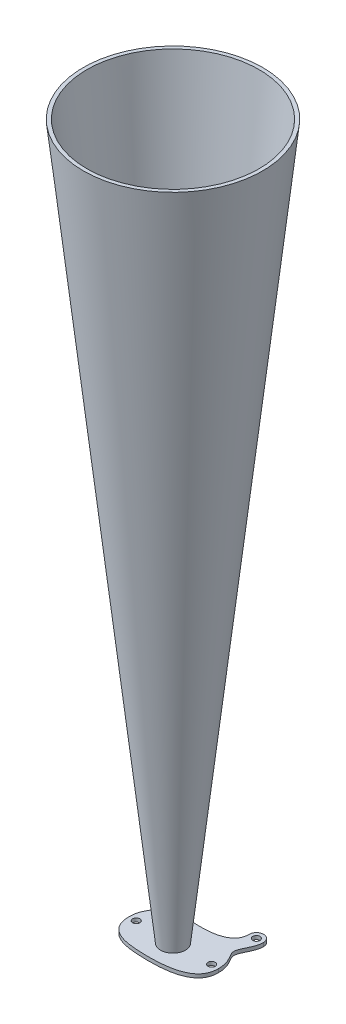
ISO-10303-21;
HEADER;
FILE_DESCRIPTION(('STEP AP214'),'2;1');
FILE_NAME('part.step','',(''),(''),'','','');
FILE_SCHEMA(('AUTOMOTIVE_DESIGN { 1 0 10303 214 1 1 1 1 }'));
ENDSEC;
DATA;
#1=APPLICATION_CONTEXT('core data for automotive mechanical design processes');
#2=APPLICATION_PROTOCOL_DEFINITION('international standard','automotive_design',2000,#1);
#3=PRODUCT_CONTEXT('',#1,'mechanical');
#4=PRODUCT('Part','Part','',(#3));
#5=PRODUCT_RELATED_PRODUCT_CATEGORY('part','',(#4));
#6=PRODUCT_DEFINITION_FORMATION('','',#4);
#7=PRODUCT_DEFINITION_CONTEXT('part definition',#1,'design');
#8=PRODUCT_DEFINITION('design','',#6,#7);
#9=PRODUCT_DEFINITION_SHAPE('','',#8);
#10=(LENGTH_UNIT() NAMED_UNIT(*) SI_UNIT(.MILLI.,.METRE.));
#11=(NAMED_UNIT(*) PLANE_ANGLE_UNIT() SI_UNIT($,.RADIAN.));
#12=(NAMED_UNIT(*) SI_UNIT($,.STERADIAN.) SOLID_ANGLE_UNIT());
#13=UNCERTAINTY_MEASURE_WITH_UNIT(LENGTH_MEASURE(1.E-05),#10,'distance_accuracy_value','');
#14=(GEOMETRIC_REPRESENTATION_CONTEXT(3) GLOBAL_UNCERTAINTY_ASSIGNED_CONTEXT((#13)) GLOBAL_UNIT_ASSIGNED_CONTEXT((#10,
#11,#12)) REPRESENTATION_CONTEXT('',''));
#15=CARTESIAN_POINT('',(0.,0.,0.));
#16=DIRECTION('',(0.,0.,1.));
#17=DIRECTION('',(1.,0.,0.));
#18=AXIS2_PLACEMENT_3D('',#15,#16,#17);
#19=CARTESIAN_POINT('',(0.5,1.,-0.5));
#20=DIRECTION('',(1.,0.,0.));
#21=DIRECTION('',(0.,0.,-1.));
#22=AXIS2_PLACEMENT_3D('',#19,#20,#21);
#23=PLANE('',#22);
#24=DIRECTION('',(0.,0.,1.));
#25=VECTOR('',#24,1.);
#26=CARTESIAN_POINT('',(0.5,0.,-0.5));
#27=LINE('',#26,#25);
#28=CARTESIAN_POINT('',(0.5,0.,-0.5));
#29=VERTEX_POINT('',#28);
#30=CARTESIAN_POINT('',(0.5,0.,0.5));
#31=VERTEX_POINT('',#30);
#32=EDGE_CURVE('E115',#29,#31,#27,.T.);
#33=ORIENTED_EDGE('',*,*,#32,.F.);
#34=DIRECTION('',(0.,-1.,0.));
#35=VECTOR('',#34,1.);
#36=CARTESIAN_POINT('',(0.5,1.,-0.5));
#37=LINE('',#36,#35);
#38=CARTESIAN_POINT('',(0.5,1.,-0.5));
#39=VERTEX_POINT('',#38);
#40=EDGE_CURVE('E12',#39,#29,#37,.T.);
#41=ORIENTED_EDGE('',*,*,#40,.F.);
#42=DIRECTION('',(0.,0.,1.));
#43=VECTOR('',#42,1.);
#44=CARTESIAN_POINT('',(0.5,1.,-0.5));
#45=LINE('',#44,#43);
#46=CARTESIAN_POINT('',(0.5,1.,0.5));
#47=VERTEX_POINT('',#46);
#48=EDGE_CURVE('E109',#39,#47,#45,.T.);
#49=ORIENTED_EDGE('',*,*,#48,.T.);
#50=DIRECTION('',(0.,-1.,0.));
#51=VECTOR('',#50,1.);
#52=CARTESIAN_POINT('',(0.5,1.,0.5));
#53=LINE('',#52,#51);
#54=EDGE_CURVE('E54',#47,#31,#53,.T.);
#55=ORIENTED_EDGE('',*,*,#54,.T.);
#56=EDGE_LOOP('',(#33,#41,#49,#55));
#57=FACE_BOUND('',#56,.T.);
#58=ADVANCED_FACE('F51',(#57),#23,.T.);
#59=CARTESIAN_POINT('',(-0.5,1.,-0.5));
#60=DIRECTION('',(0.,0.,-1.));
#61=DIRECTION('',(-1.,0.,0.));
#62=AXIS2_PLACEMENT_3D('',#59,#60,#61);
#63=PLANE('',#62);
#64=DIRECTION('',(1.,0.,0.));
#65=VECTOR('',#64,1.);
#66=CARTESIAN_POINT('',(-0.5,0.,-0.5));
#67=LINE('',#66,#65);
#68=CARTESIAN_POINT('',(-0.5,0.,-0.5));
#69=VERTEX_POINT('',#68);
#70=EDGE_CURVE('E111',#69,#29,#67,.T.);
#71=ORIENTED_EDGE('',*,*,#70,.F.);
#72=DIRECTION('',(0.,-1.,0.));
#73=VECTOR('',#72,1.);
#74=CARTESIAN_POINT('',(-0.5,1.,-0.5));
#75=LINE('',#74,#73);
#76=CARTESIAN_POINT('',(-0.5,1.,-0.5));
#77=VERTEX_POINT('',#76);
#78=EDGE_CURVE('E60',#77,#69,#75,.T.);
#79=ORIENTED_EDGE('',*,*,#78,.F.);
#80=DIRECTION('',(1.,0.,0.));
#81=VECTOR('',#80,1.);
#82=CARTESIAN_POINT('',(-0.5,1.,-0.5));
#83=LINE('',#82,#81);
#84=EDGE_CURVE('E106',#77,#39,#83,.T.);
#85=ORIENTED_EDGE('',*,*,#84,.T.);
#86=ORIENTED_EDGE('',*,*,#40,.T.);
#87=EDGE_LOOP('',(#71,#79,#85,#86));
#88=FACE_BOUND('',#87,.T.);
#89=ADVANCED_FACE('F125',(#88),#63,.T.);
#90=CARTESIAN_POINT('',(-0.5,1.,-0.5));
#91=DIRECTION('',(-1.,0.,0.));
#92=DIRECTION('',(0.,0.,1.));
#93=AXIS2_PLACEMENT_3D('',#90,#91,#92);
#94=PLANE('',#93);
#95=DIRECTION('',(0.,0.,-1.));
#96=VECTOR('',#95,1.);
#97=CARTESIAN_POINT('',(-0.5,0.,-0.5));
#98=LINE('',#97,#96);
#99=CARTESIAN_POINT('',(-0.5,0.,0.5));
#100=VERTEX_POINT('',#99);
#101=EDGE_CURVE('E101',#100,#69,#98,.T.);
#102=ORIENTED_EDGE('',*,*,#101,.F.);
#103=DIRECTION('',(0.,-1.,0.));
#104=VECTOR('',#103,1.);
#105=CARTESIAN_POINT('',(-0.5,1.,0.5));
#106=LINE('',#105,#104);
#107=CARTESIAN_POINT('',(-0.5,1.,0.5));
#108=VERTEX_POINT('',#107);
#109=EDGE_CURVE('E96',#108,#100,#106,.T.);
#110=ORIENTED_EDGE('',*,*,#109,.F.);
#111=DIRECTION('',(0.,0.,-1.));
#112=VECTOR('',#111,1.);
#113=CARTESIAN_POINT('',(-0.5,1.,-0.5));
#114=LINE('',#113,#112);
#115=EDGE_CURVE('E99',#108,#77,#114,.T.);
#116=ORIENTED_EDGE('',*,*,#115,.T.);
#117=ORIENTED_EDGE('',*,*,#78,.T.);
#118=EDGE_LOOP('',(#102,#110,#116,#117));
#119=FACE_BOUND('',#118,.T.);
#120=ADVANCED_FACE('F98',(#119),#94,.T.);
#121=CARTESIAN_POINT('',(-0.5,1.,0.5));
#122=DIRECTION('',(0.,0.,1.));
#123=DIRECTION('',(1.,0.,0.));
#124=AXIS2_PLACEMENT_3D('',#121,#122,#123);
#125=PLANE('',#124);
#126=DIRECTION('',(-1.,0.,0.));
#127=VECTOR('',#126,1.);
#128=CARTESIAN_POINT('',(-0.5,0.,0.5));
#129=LINE('',#128,#127);
#130=EDGE_CURVE('E118',#31,#100,#129,.T.);
#131=ORIENTED_EDGE('',*,*,#130,.F.);
#132=ORIENTED_EDGE('',*,*,#54,.F.);
#133=DIRECTION('',(-1.,0.,0.));
#134=VECTOR('',#133,1.);
#135=CARTESIAN_POINT('',(-0.5,1.,0.5));
#136=LINE('',#135,#134);
#137=EDGE_CURVE('E105',#47,#108,#136,.T.);
#138=ORIENTED_EDGE('',*,*,#137,.T.);
#139=ORIENTED_EDGE('',*,*,#109,.T.);
#140=EDGE_LOOP('',(#131,#132,#138,#139));
#141=FACE_BOUND('',#140,.T.);
#142=ADVANCED_FACE('F108',(#141),#125,.T.);
#143=CARTESIAN_POINT('',(0.,1.,0.));
#144=DIRECTION('',(0.,1.,0.));
#145=DIRECTION('',(0.,0.,1.));
#146=AXIS2_PLACEMENT_3D('',#143,#144,#145);
#147=PLANE('',#146);
#148=ORIENTED_EDGE('',*,*,#48,.F.);
#149=ORIENTED_EDGE('',*,*,#84,.F.);
#150=ORIENTED_EDGE('',*,*,#115,.F.);
#151=ORIENTED_EDGE('',*,*,#137,.F.);
#152=EDGE_LOOP('',(#148,#149,#150,#151));
#153=FACE_BOUND('',#152,.T.);
#154=ADVANCED_FACE('F104',(#153),#147,.T.);
#155=CARTESIAN_POINT('',(0.,0.,0.));
#156=DIRECTION('',(0.,1.,0.));
#157=DIRECTION('',(0.,0.,1.));
#158=AXIS2_PLACEMENT_3D('',#155,#156,#157);
#159=PLANE('',#158);
#160=ORIENTED_EDGE('',*,*,#32,.T.);
#161=ORIENTED_EDGE('',*,*,#130,.T.);
#162=ORIENTED_EDGE('',*,*,#101,.T.);
#163=ORIENTED_EDGE('',*,*,#70,.T.);
#164=EDGE_LOOP('',(#160,#161,#162,#163));
#165=FACE_BOUND('',#164,.T.);
#166=ADVANCED_FACE('F124',(#165),#159,.F.);
#167=CLOSED_SHELL('',(#58,#89,#120,#142,#154,#166));
#168=MANIFOLD_SOLID_BREP('B2',#167);
#169=CARTESIAN_POINT('',(0.,200.,0.));
#170=DIRECTION('',(0.,1.,0.));
#171=DIRECTION('',(0.,0.,1.));
#172=AXIS2_PLACEMENT_3D('',#169,#170,#171);
#173=CONICAL_SURFACE('',#172,25.,0.107830121412939);
#174=CARTESIAN_POINT('',(0.,200.,0.));
#175=DIRECTION('',(0.,-1.,0.));
#176=DIRECTION('',(0.,0.,-1.));
#177=AXIS2_PLACEMENT_3D('',#174,#175,#176);
#178=CIRCLE('',#177,25.);
#179=CARTESIAN_POINT('',(0.,200.,25.));
#180=VERTEX_POINT('',#179);
#181=EDGE_CURVE('E184',#180,#180,#178,.T.);
#182=CARTESIAN_POINT('',(0.,1.,0.));
#183=DIRECTION('',(0.,-1.,0.));
#184=DIRECTION('',(0.,0.,-1.));
#185=AXIS2_PLACEMENT_3D('',#182,#183,#184);
#186=CIRCLE('',#185,3.45825);
#187=CARTESIAN_POINT('',(0.,1.,3.45825));
#188=VERTEX_POINT('',#187);
#189=EDGE_CURVE('E49',#188,#188,#186,.T.);
#190=CARTESIAN_POINT('',(0.,200.,25.));
#191=CARTESIAN_POINT('',(0.,197.927083333333,24.7756067708333));
#192=CARTESIAN_POINT('',(0.,195.854166666667,24.5512135416667));
#193=CARTESIAN_POINT('',(0.,191.708333333333,24.1024270833333));
#194=CARTESIAN_POINT('',(0.,189.635416666667,23.8780338541667));
#195=CARTESIAN_POINT('',(0.,185.489583333333,23.4292473958333));
#196=CARTESIAN_POINT('',(0.,183.416666666667,23.2048541666667));
#197=CARTESIAN_POINT('',(0.,179.270833333333,22.7560677083333));
#198=CARTESIAN_POINT('',(0.,177.197916666667,22.5316744791667));
#199=CARTESIAN_POINT('',(0.,173.052083333333,22.0828880208333));
#200=CARTESIAN_POINT('',(0.,170.979166666667,21.8584947916667));
#201=CARTESIAN_POINT('',(0.,166.833333333333,21.4097083333333));
#202=CARTESIAN_POINT('',(0.,164.760416666667,21.1853151041667));
#203=CARTESIAN_POINT('',(0.,160.614583333333,20.7365286458333));
#204=CARTESIAN_POINT('',(0.,158.541666666667,20.5121354166667));
#205=CARTESIAN_POINT('',(0.,154.395833333333,20.0633489583333));
#206=CARTESIAN_POINT('',(0.,152.322916666667,19.8389557291667));
#207=CARTESIAN_POINT('',(0.,148.177083333333,19.3901692708333));
#208=CARTESIAN_POINT('',(0.,146.104166666667,19.1657760416667));
#209=CARTESIAN_POINT('',(0.,141.958333333333,18.7169895833333));
#210=CARTESIAN_POINT('',(0.,139.885416666667,18.4925963541667));
#211=CARTESIAN_POINT('',(0.,135.739583333333,18.0438098958333));
#212=CARTESIAN_POINT('',(0.,133.666666666667,17.8194166666667));
#213=CARTESIAN_POINT('',(0.,129.520833333333,17.3706302083333));
#214=CARTESIAN_POINT('',(0.,127.447916666667,17.1462369791667));
#215=CARTESIAN_POINT('',(0.,123.302083333333,16.6974505208333));
#216=CARTESIAN_POINT('',(0.,121.229166666667,16.4730572916667));
#217=CARTESIAN_POINT('',(0.,117.083333333333,16.0242708333333));
#218=CARTESIAN_POINT('',(0.,115.010416666667,15.7998776041667));
#219=CARTESIAN_POINT('',(0.,110.864583333333,15.3510911458333));
#220=CARTESIAN_POINT('',(0.,108.791666666667,15.1266979166667));
#221=CARTESIAN_POINT('',(0.,104.645833333333,14.6779114583333));
#222=CARTESIAN_POINT('',(0.,102.572916666667,14.4535182291667));
#223=CARTESIAN_POINT('',(0.,98.4270833333333,14.0047317708333));
#224=CARTESIAN_POINT('',(0.,96.3541666666667,13.7803385416667));
#225=CARTESIAN_POINT('',(0.,92.2083333333333,13.3315520833333));
#226=CARTESIAN_POINT('',(0.,90.1354166666667,13.1071588541667));
#227=CARTESIAN_POINT('',(0.,85.9895833333333,12.6583723958333));
#228=CARTESIAN_POINT('',(0.,83.9166666666667,12.4339791666667));
#229=CARTESIAN_POINT('',(0.,79.7708333333333,11.9851927083333));
#230=CARTESIAN_POINT('',(0.,77.6979166666667,11.7607994791667));
#231=CARTESIAN_POINT('',(0.,73.5520833333333,11.3120130208333));
#232=CARTESIAN_POINT('',(0.,71.4791666666667,11.0876197916667));
#233=CARTESIAN_POINT('',(0.,67.3333333333333,10.6388333333333));
#234=CARTESIAN_POINT('',(0.,65.2604166666667,10.4144401041667));
#235=CARTESIAN_POINT('',(0.,61.1145833333333,9.96565364583333));
#236=CARTESIAN_POINT('',(0.,59.0416666666667,9.74126041666667));
#237=CARTESIAN_POINT('',(0.,54.8958333333333,9.29247395833334));
#238=CARTESIAN_POINT('',(0.,52.8229166666667,9.06808072916667));
#239=CARTESIAN_POINT('',(0.,48.6770833333333,8.61929427083334));
#240=CARTESIAN_POINT('',(0.,46.6041666666667,8.39490104166667));
#241=CARTESIAN_POINT('',(0.,42.4583333333333,7.94611458333333));
#242=CARTESIAN_POINT('',(0.,40.3854166666667,7.72172135416667));
#243=CARTESIAN_POINT('',(0.,36.2395833333333,7.27293489583333));
#244=CARTESIAN_POINT('',(0.,34.1666666666667,7.04854166666667));
#245=CARTESIAN_POINT('',(0.,30.0208333333333,6.59975520833333));
#246=CARTESIAN_POINT('',(0.,27.9479166666667,6.37536197916667));
#247=CARTESIAN_POINT('',(0.,23.8020833333333,5.92657552083334));
#248=CARTESIAN_POINT('',(0.,21.7291666666667,5.70218229166667));
#249=CARTESIAN_POINT('',(0.,17.5833333333333,5.25339583333333));
#250=CARTESIAN_POINT('',(0.,15.5104166666667,5.02900260416667));
#251=CARTESIAN_POINT('',(0.,11.3645833333333,4.58021614583333));
#252=CARTESIAN_POINT('',(0.,9.29166666666666,4.35582291666667));
#253=CARTESIAN_POINT('',(0.,5.14583333333333,3.90703645833334));
#254=CARTESIAN_POINT('',(0.,3.07291666666666,3.68264322916667));
#255=CARTESIAN_POINT('',(0.,1.,3.45825));
#256=B_SPLINE_CURVE_WITH_KNOTS('',3,(#190,#191,#192,#193,#194,#195,#196,#197,#198,#199,#200,
#201,#202,#203,#204,#205,#206,#207,#208,#209,#210,#211,#212,#213,#214,#215,#216,#217,#218,#219,
#220,#221,#222,#223,#224,#225,#226,#227,#228,#229,#230,#231,#232,#233,#234,#235,#236,#237,#238,
#239,#240,#241,#242,#243,#244,#245,#246,#247,#248,#249,#250,#251,#252,#253,#254,#255),
.UNSPECIFIED.,.F.,.F.,(4,2,2,2,2,2,2,2,2,2,2,2,2,2,2,2,2,2,2,2,2,2,2,2,2,2,2,2,2,2,2,2,4),(0.,
6.25507973203882,12.5101594640776,18.7652391961164,25.0203189281552,31.275398660194,
37.5304783922328,43.7855581242716,50.0406378563104,56.2957175883492,62.550797320388,
68.8058770524268,75.0609567844656,81.3160365165045,87.5711162485433,93.8261959805821,
100.081275712621,106.33635544466,112.591435176698,118.846514908737,125.101594640776,
131.356674372815,137.611754104854,143.866833836892,150.121913568931,156.37699330097,
162.632073033009,168.887152765048,175.142232497086,181.397312229125,187.652391961164,
193.907471693203,200.162551425242),.UNSPECIFIED.);
#257=EDGE_CURVE('BSEAM175',#180,#188,#256,.T.);
#258=ORIENTED_EDGE('',*,*,#181,.T.);
#259=ORIENTED_EDGE('',*,*,#189,.F.);
#260=ORIENTED_EDGE('',*,*,#257,.T.);
#261=ORIENTED_EDGE('',*,*,#257,.F.);
#262=EDGE_LOOP('',(#258,#260,#259,#261));
#263=FACE_BOUND('',#262,.T.);
#264=ADVANCED_FACE('F175',(#263),#173,.T.);
#265=CARTESIAN_POINT('',(0.,0.,0.));
#266=DIRECTION('',(0.,1.,0.));
#267=DIRECTION('',(0.,0.,1.));
#268=AXIS2_PLACEMENT_3D('',#265,#266,#267);
#269=PLANE('',#268);
#270=CARTESIAN_POINT('',(0.,0.,0.));
#271=DIRECTION('',(0.,1.,0.));
#272=DIRECTION('',(0.,0.,1.));
#273=AXIS2_PLACEMENT_3D('',#270,#271,#272);
#274=CIRCLE('',#273,2.34415803303899);
#275=CARTESIAN_POINT('',(0.,0.,2.34415803303899));
#276=VERTEX_POINT('',#275);
#277=EDGE_CURVE('E340',#276,#276,#274,.F.);
#278=ORIENTED_EDGE('',*,*,#277,.F.);
#279=EDGE_LOOP('',(#278));
#280=FACE_BOUND('',#279,.T.);
#281=CARTESIAN_POINT('',(-10.5,0.,-12.75));
#282=DIRECTION('',(0.,-1.,0.));
#283=DIRECTION('',(0.,0.,-1.));
#284=AXIS2_PLACEMENT_3D('',#281,#282,#283);
#285=CIRCLE('',#284,0.999999999999998);
#286=CARTESIAN_POINT('',(-10.5,0.,-13.75));
#287=VERTEX_POINT('',#286);
#288=EDGE_CURVE('E267',#287,#287,#285,.T.);
#289=ORIENTED_EDGE('',*,*,#288,.F.);
#290=EDGE_LOOP('',(#289));
#291=FACE_BOUND('',#290,.T.);
#292=CARTESIAN_POINT('',(10.5,0.,-12.75));
#293=DIRECTION('',(0.,-1.,0.));
#294=DIRECTION('',(0.,0.,-1.));
#295=AXIS2_PLACEMENT_3D('',#292,#293,#294);
#296=CIRCLE('',#295,0.999999999999998);
#297=CARTESIAN_POINT('',(10.5,0.,-13.75));
#298=VERTEX_POINT('',#297);
#299=EDGE_CURVE('E432',#298,#298,#296,.T.);
#300=ORIENTED_EDGE('',*,*,#299,.F.);
#301=EDGE_LOOP('',(#300));
#302=FACE_BOUND('',#301,.T.);
#303=CARTESIAN_POINT('',(-10.5,0.,-0.250000000000002));
#304=DIRECTION('',(0.,-1.,0.));
#305=DIRECTION('',(0.,0.,-1.));
#306=AXIS2_PLACEMENT_3D('',#303,#304,#305);
#307=CIRCLE('',#306,1.);
#308=CARTESIAN_POINT('',(-10.5,0.,-1.25));
#309=VERTEX_POINT('',#308);
#310=EDGE_CURVE('E390',#309,#309,#307,.T.);
#311=ORIENTED_EDGE('',*,*,#310,.F.);
#312=EDGE_LOOP('',(#311));
#313=FACE_BOUND('',#312,.T.);
#314=CARTESIAN_POINT('',(10.5,0.,-0.250000000000002));
#315=DIRECTION('',(0.,-1.,0.));
#316=DIRECTION('',(0.,0.,-1.));
#317=AXIS2_PLACEMENT_3D('',#314,#315,#316);
#318=CIRCLE('',#317,1.);
#319=CARTESIAN_POINT('',(10.5,0.,-1.25));
#320=VERTEX_POINT('',#319);
#321=EDGE_CURVE('E385',#320,#320,#318,.T.);
#322=ORIENTED_EDGE('',*,*,#321,.F.);
#323=EDGE_LOOP('',(#322));
#324=FACE_BOUND('',#323,.T.);
#325=CARTESIAN_POINT('',(10.5,0.,-12.75));
#326=DIRECTION('',(0.,-1.,0.));
#327=DIRECTION('',(0.,0.,-1.));
#328=AXIS2_PLACEMENT_3D('',#325,#326,#327);
#329=CIRCLE('',#328,2.);
#330=CARTESIAN_POINT('',(8.50000000000001,0.,-12.75));
#331=VERTEX_POINT('',#330);
#332=CARTESIAN_POINT('',(12.5,0.,-12.75));
#333=VERTEX_POINT('',#332);
#334=EDGE_CURVE('E382',#331,#333,#329,.T.);
#335=ORIENTED_EDGE('',*,*,#334,.T.);
#336=CARTESIAN_POINT('',(12.5,0.,-12.75));
#337=CARTESIAN_POINT('',(12.5,0.,-10.2765296533907));
#338=CARTESIAN_POINT('',(8.5,0.,-5.91813910307173));
#339=CARTESIAN_POINT('',(12.5,0.,-3.88719214046587));
#340=CARTESIAN_POINT('',(12.5,0.,-0.249999999999999));
#341=B_SPLINE_CURVE_WITH_KNOTS('',3,(#336,#337,#338,#339,#340),.UNSPECIFIED.,.F.,.F.,(4,1,4),
(0.,0.500000000000001,1.),.UNSPECIFIED.);
#342=CARTESIAN_POINT('',(12.5,0.,-0.250000000000006));
#343=VERTEX_POINT('',#342);
#344=EDGE_CURVE('E384',#333,#343,#341,.T.);
#345=ORIENTED_EDGE('',*,*,#344,.T.);
#346=CARTESIAN_POINT('',(-12.5,0.,-0.250000000000002));
#347=CARTESIAN_POINT('',(-12.5,0.,5.6281700909457));
#348=CARTESIAN_POINT('',(-1.33808459921734,0.,7.62891925451375));
#349=CARTESIAN_POINT('',(12.6581927496148,0.,6.11399140002679));
#350=CARTESIAN_POINT('',(12.5,0.,-0.250000000000006));
#351=B_SPLINE_CURVE_WITH_KNOTS('',3,(#346,#347,#348,#349,#350),.UNSPECIFIED.,.F.,.F.,(4,1,4),
(0.,0.45,1.),.UNSPECIFIED.);
#352=CARTESIAN_POINT('',(-12.5,0.,-0.250000000000002));
#353=VERTEX_POINT('',#352);
#354=EDGE_CURVE('E387',#353,#343,#351,.T.);
#355=ORIENTED_EDGE('',*,*,#354,.F.);
#356=CARTESIAN_POINT('',(-12.5,0.,-12.75));
#357=CARTESIAN_POINT('',(-12.5,0.,-10.2765296533907));
#358=CARTESIAN_POINT('',(-8.5,0.,-5.91813910307173));
#359=CARTESIAN_POINT('',(-12.5,0.,-3.88719214046587));
#360=CARTESIAN_POINT('',(-12.5,0.,-0.249999999999999));
#361=B_SPLINE_CURVE_WITH_KNOTS('',3,(#356,#357,#358,#359,#360),.UNSPECIFIED.,.F.,.F.,(4,1,4),
(0.,0.500000000000001,1.),.UNSPECIFIED.);
#362=CARTESIAN_POINT('',(-12.5,0.,-12.75));
#363=VERTEX_POINT('',#362);
#364=EDGE_CURVE('E324',#363,#353,#361,.T.);
#365=ORIENTED_EDGE('',*,*,#364,.F.);
#366=CARTESIAN_POINT('',(-10.5,0.,-12.75));
#367=DIRECTION('',(0.,-1.,0.));
#368=DIRECTION('',(0.,0.,-1.));
#369=AXIS2_PLACEMENT_3D('',#366,#367,#368);
#370=CIRCLE('',#369,2.);
#371=CARTESIAN_POINT('',(-8.5,0.,-12.75));
#372=VERTEX_POINT('',#371);
#373=EDGE_CURVE('E241',#363,#372,#370,.T.);
#374=ORIENTED_EDGE('',*,*,#373,.T.);
#375=CARTESIAN_POINT('',(-8.5,0.,-12.75));
#376=CARTESIAN_POINT('',(-8.49999999999999,0.,-8.81267857547799));
#377=CARTESIAN_POINT('',(-0.912294306825983,0.,-6.89567856791905));
#378=CARTESIAN_POINT('',(8.61187548980992,0.,-8.39596428868391));
#379=CARTESIAN_POINT('',(8.5,0.,-12.75));
#380=B_SPLINE_CURVE_WITH_KNOTS('',3,(#375,#376,#377,#378,#379),.UNSPECIFIED.,.F.,.F.,(4,1,4),
(0.,0.45,1.),.UNSPECIFIED.);
#381=EDGE_CURVE('E317',#372,#331,#380,.T.);
#382=ORIENTED_EDGE('',*,*,#381,.T.);
#383=EDGE_LOOP('',(#335,#345,#355,#365,#374,#382));
#384=FACE_BOUND('',#383,.T.);
#385=ADVANCED_FACE('F177',(#280,#291,#302,#313,#324,#384),#269,.F.);
#386=CARTESIAN_POINT('',(0.,200.,0.));
#387=DIRECTION('',(0.,1.,0.));
#388=DIRECTION('',(0.,0.,1.));
#389=AXIS2_PLACEMENT_3D('',#386,#387,#388);
#390=PLANE('',#389);
#391=CARTESIAN_POINT('',(0.,200.,0.));
#392=DIRECTION('',(0.,1.,0.));
#393=DIRECTION('',(0.,0.,1.));
#394=AXIS2_PLACEMENT_3D('',#391,#392,#393);
#395=CIRCLE('',#394,23.994158033039);
#396=CARTESIAN_POINT('',(0.,200.,23.994158033039));
#397=VERTEX_POINT('',#396);
#398=EDGE_CURVE('E334',#397,#397,#395,.F.);
#399=ORIENTED_EDGE('',*,*,#398,.T.);
#400=EDGE_LOOP('',(#399));
#401=FACE_BOUND('',#400,.T.);
#402=ORIENTED_EDGE('',*,*,#181,.F.);
#403=EDGE_LOOP('',(#402));
#404=FACE_BOUND('',#403,.T.);
#405=ADVANCED_FACE('F349',(#401,#404),#390,.T.);
#406=CARTESIAN_POINT('',(0.,200.107621280038,0.));
#407=DIRECTION('',(0.,1.,0.));
#408=DIRECTION('',(0.,0.,1.));
#409=AXIS2_PLACEMENT_3D('',#406,#407,#408);
#410=CONICAL_SURFACE('',#409,24.0058080366031,0.107830121412939);
#411=CARTESIAN_POINT('',(0.,0.,2.34415803303899));
#412=CARTESIAN_POINT('',(0.,2.08333333333334,2.56967886637232));
#413=CARTESIAN_POINT('',(0.,4.16666666666667,2.79519969970566));
#414=CARTESIAN_POINT('',(0.,8.33333333333334,3.24624136637232));
#415=CARTESIAN_POINT('',(0.,10.4166666666667,3.47176219970565));
#416=CARTESIAN_POINT('',(0.,14.5833333333333,3.92280386637232));
#417=CARTESIAN_POINT('',(0.,16.6666666666667,4.14832469970565));
#418=CARTESIAN_POINT('',(0.,20.8333333333333,4.59936636637232));
#419=CARTESIAN_POINT('',(0.,22.9166666666667,4.82488719970566));
#420=CARTESIAN_POINT('',(0.,27.0833333333333,5.27592886637232));
#421=CARTESIAN_POINT('',(0.,29.1666666666667,5.50144969970565));
#422=CARTESIAN_POINT('',(0.,33.3333333333333,5.95249136637232));
#423=CARTESIAN_POINT('',(0.,35.4166666666667,6.17801219970565));
#424=CARTESIAN_POINT('',(0.,39.5833333333333,6.62905386637232));
#425=CARTESIAN_POINT('',(0.,41.6666666666667,6.85457469970566));
#426=CARTESIAN_POINT('',(0.,45.8333333333333,7.30561636637232));
#427=CARTESIAN_POINT('',(0.,47.9166666666667,7.53113719970566));
#428=CARTESIAN_POINT('',(0.,52.0833333333333,7.98217886637232));
#429=CARTESIAN_POINT('',(0.,54.1666666666667,8.20769969970565));
#430=CARTESIAN_POINT('',(0.,58.3333333333333,8.65874136637232));
#431=CARTESIAN_POINT('',(0.,60.4166666666667,8.88426219970565));
#432=CARTESIAN_POINT('',(0.,64.5833333333333,9.33530386637232));
#433=CARTESIAN_POINT('',(0.,66.6666666666667,9.56082469970566));
#434=CARTESIAN_POINT('',(0.,70.8333333333333,10.0118663663723));
#435=CARTESIAN_POINT('',(0.,72.9166666666667,10.2373871997057));
#436=CARTESIAN_POINT('',(0.,77.0833333333333,10.6884288663723));
#437=CARTESIAN_POINT('',(0.,79.1666666666667,10.9139496997057));
#438=CARTESIAN_POINT('',(0.,83.3333333333333,11.3649913663723));
#439=CARTESIAN_POINT('',(0.,85.4166666666667,11.5905121997057));
#440=CARTESIAN_POINT('',(0.,89.5833333333333,12.0415538663723));
#441=CARTESIAN_POINT('',(0.,91.6666666666667,12.2670746997057));
#442=CARTESIAN_POINT('',(0.,95.8333333333333,12.7181163663723));
#443=CARTESIAN_POINT('',(0.,97.9166666666667,12.9436371997057));
#444=CARTESIAN_POINT('',(0.,102.083333333333,13.3946788663723));
#445=CARTESIAN_POINT('',(0.,104.166666666667,13.6201996997057));
#446=CARTESIAN_POINT('',(0.,108.333333333333,14.0712413663723));
#447=CARTESIAN_POINT('',(0.,110.416666666667,14.2967621997057));
#448=CARTESIAN_POINT('',(0.,114.583333333333,14.7478038663723));
#449=CARTESIAN_POINT('',(0.,116.666666666667,14.9733246997057));
#450=CARTESIAN_POINT('',(0.,120.833333333333,15.4243663663723));
#451=CARTESIAN_POINT('',(0.,122.916666666667,15.6498871997057));
#452=CARTESIAN_POINT('',(0.,127.083333333333,16.1009288663723));
#453=CARTESIAN_POINT('',(0.,129.166666666667,16.3264496997057));
#454=CARTESIAN_POINT('',(0.,133.333333333333,16.7774913663723));
#455=CARTESIAN_POINT('',(0.,135.416666666667,17.0030121997057));
#456=CARTESIAN_POINT('',(0.,139.583333333333,17.4540538663723));
#457=CARTESIAN_POINT('',(0.,141.666666666667,17.6795746997057));
#458=CARTESIAN_POINT('',(0.,145.833333333333,18.1306163663723));
#459=CARTESIAN_POINT('',(0.,147.916666666667,18.3561371997057));
#460=CARTESIAN_POINT('',(0.,152.083333333333,18.8071788663723));
#461=CARTESIAN_POINT('',(0.,154.166666666667,19.0326996997057));
#462=CARTESIAN_POINT('',(0.,158.333333333333,19.4837413663723));
#463=CARTESIAN_POINT('',(0.,160.416666666667,19.7092621997057));
#464=CARTESIAN_POINT('',(0.,164.583333333333,20.1603038663723));
#465=CARTESIAN_POINT('',(0.,166.666666666667,20.3858246997057));
#466=CARTESIAN_POINT('',(0.,170.833333333333,20.8368663663723));
#467=CARTESIAN_POINT('',(0.,172.916666666667,21.0623871997057));
#468=CARTESIAN_POINT('',(0.,177.083333333333,21.5134288663723));
#469=CARTESIAN_POINT('',(0.,179.166666666667,21.7389496997057));
#470=CARTESIAN_POINT('',(0.,183.333333333333,22.1899913663723));
#471=CARTESIAN_POINT('',(0.,185.416666666667,22.4155121997057));
#472=CARTESIAN_POINT('',(0.,189.583333333333,22.8665538663723));
#473=CARTESIAN_POINT('',(0.,191.666666666667,23.0920746997057));
#474=CARTESIAN_POINT('',(0.,195.833333333333,23.5431163663723));
#475=CARTESIAN_POINT('',(0.,197.916666666667,23.7686371997057));
#476=CARTESIAN_POINT('',(0.,200.,23.994158033039));
#477=B_SPLINE_CURVE_WITH_KNOTS('',3,(#411,#412,#413,#414,#415,#416,#417,#418,#419,#420,#421,
#422,#423,#424,#425,#426,#427,#428,#429,#430,#431,#432,#433,#434,#435,#436,#437,#438,#439,#440,
#441,#442,#443,#444,#445,#446,#447,#448,#449,#450,#451,#452,#453,#454,#455,#456,#457,#458,#459,
#460,#461,#462,#463,#464,#465,#466,#467,#468,#469,#470,#471,#472,#473,#474,#475,#476),
.UNSPECIFIED.,.F.,.F.,(4,2,2,2,2,2,2,2,2,2,2,2,2,2,2,2,2,2,2,2,2,2,2,2,2,2,2,2,2,2,2,2,4),(0.,
6.28651229350634,12.5730245870127,18.859536880519,25.1460491740253,31.4325614675317,
37.719073761038,44.0055860545443,50.2920983480507,56.578610641557,62.8651229350633,
69.1516352285697,75.438147522076,81.7246598155823,88.0111721090887,94.297684402595,
100.584196696101,106.870708989608,113.157221283114,119.44373357662,125.730245870127,
132.016758163633,138.303270457139,144.589782750646,150.876295044152,157.162807337658,
163.449319631165,169.735831924671,176.022344218177,182.308856511684,188.59536880519,
194.881881098696,201.168393392203),.UNSPECIFIED.);
#478=EDGE_CURVE('BSEAM351',#276,#397,#477,.T.);
#479=ORIENTED_EDGE('',*,*,#277,.T.);
#480=ORIENTED_EDGE('',*,*,#398,.F.);
#481=ORIENTED_EDGE('',*,*,#478,.T.);
#482=ORIENTED_EDGE('',*,*,#478,.F.);
#483=EDGE_LOOP('',(#479,#481,#480,#482));
#484=FACE_BOUND('',#483,.T.);
#485=ADVANCED_FACE('F351',(#484),#410,.F.);
#486=CARTESIAN_POINT('',(10.5,1.,-12.75));
#487=DIRECTION('',(0.,-1.,0.));
#488=DIRECTION('',(0.,0.,-1.));
#489=AXIS2_PLACEMENT_3D('',#486,#487,#488);
#490=CYLINDRICAL_SURFACE('',#489,2.);
#491=ORIENTED_EDGE('',*,*,#334,.F.);
#492=DIRECTION('',(0.,-1.,0.));
#493=VECTOR('',#492,1.);
#494=CARTESIAN_POINT('',(8.50000000000001,1.,-12.75));
#495=LINE('',#494,#493);
#496=CARTESIAN_POINT('',(8.50000000000001,1.,-12.75));
#497=VERTEX_POINT('',#496);
#498=EDGE_CURVE('E192',#497,#331,#495,.T.);
#499=ORIENTED_EDGE('',*,*,#498,.F.);
#500=CARTESIAN_POINT('',(10.5,1.,-12.75));
#501=DIRECTION('',(0.,-1.,0.));
#502=DIRECTION('',(0.,0.,-1.));
#503=AXIS2_PLACEMENT_3D('',#500,#501,#502);
#504=CIRCLE('',#503,2.);
#505=CARTESIAN_POINT('',(12.5,1.,-12.75));
#506=VERTEX_POINT('',#505);
#507=EDGE_CURVE('E301',#497,#506,#504,.T.);
#508=ORIENTED_EDGE('',*,*,#507,.T.);
#509=DIRECTION('',(0.,-1.,0.));
#510=VECTOR('',#509,1.);
#511=CARTESIAN_POINT('',(12.5,1.,-12.75));
#512=LINE('',#511,#510);
#513=EDGE_CURVE('E227',#506,#333,#512,.T.);
#514=ORIENTED_EDGE('',*,*,#513,.T.);
#515=EDGE_LOOP('',(#491,#499,#508,#514));
#516=FACE_BOUND('',#515,.T.);
#517=ADVANCED_FACE('F277',(#516),#490,.T.);
#518=CARTESIAN_POINT('',(-8.5,1.,-12.75));
#519=CARTESIAN_POINT('',(-8.49999999999999,1.,-8.81267857547799));
#520=CARTESIAN_POINT('',(-0.912294306825983,1.,-6.89567856791905));
#521=CARTESIAN_POINT('',(8.61187548980992,1.,-8.39596428868391));
#522=CARTESIAN_POINT('',(8.5,1.,-12.75));
#523=B_SPLINE_CURVE_WITH_KNOTS('',3,(#518,#519,#520,#521,#522),.UNSPECIFIED.,.F.,.F.,(4,1,4),
(0.,0.45,1.),.UNSPECIFIED.);
#524=DIRECTION('',(0.,-1.,0.));
#525=VECTOR('',#524,1.);
#526=SURFACE_OF_LINEAR_EXTRUSION('',#523,#525);
#527=ORIENTED_EDGE('',*,*,#381,.F.);
#528=DIRECTION('',(0.,-1.,0.));
#529=VECTOR('',#528,1.);
#530=CARTESIAN_POINT('',(-8.5,1.,-12.75));
#531=LINE('',#530,#529);
#532=CARTESIAN_POINT('',(-8.5,1.,-12.75));
#533=VERTEX_POINT('',#532);
#534=EDGE_CURVE('E215',#533,#372,#531,.T.);
#535=ORIENTED_EDGE('',*,*,#534,.F.);
#536=EDGE_CURVE('E256',#533,#497,#523,.T.);
#537=ORIENTED_EDGE('',*,*,#536,.T.);
#538=ORIENTED_EDGE('',*,*,#498,.T.);
#539=EDGE_LOOP('',(#527,#535,#537,#538));
#540=FACE_BOUND('',#539,.T.);
#541=ADVANCED_FACE('F273',(#540),#526,.T.);
#542=CARTESIAN_POINT('',(-10.5,1.,-12.75));
#543=DIRECTION('',(0.,-1.,0.));
#544=DIRECTION('',(0.,0.,-1.));
#545=AXIS2_PLACEMENT_3D('',#542,#543,#544);
#546=CYLINDRICAL_SURFACE('',#545,2.);
#547=ORIENTED_EDGE('',*,*,#373,.F.);
#548=DIRECTION('',(0.,-1.,0.));
#549=VECTOR('',#548,1.);
#550=CARTESIAN_POINT('',(-12.5,1.,-12.75));
#551=LINE('',#550,#549);
#552=CARTESIAN_POINT('',(-12.5,1.,-12.75));
#553=VERTEX_POINT('',#552);
#554=EDGE_CURVE('E235',#553,#363,#551,.T.);
#555=ORIENTED_EDGE('',*,*,#554,.F.);
#556=CARTESIAN_POINT('',(-10.5,1.,-12.75));
#557=DIRECTION('',(0.,-1.,0.));
#558=DIRECTION('',(0.,0.,-1.));
#559=AXIS2_PLACEMENT_3D('',#556,#557,#558);
#560=CIRCLE('',#559,2.);
#561=EDGE_CURVE('E239',#553,#533,#560,.T.);
#562=ORIENTED_EDGE('',*,*,#561,.T.);
#563=ORIENTED_EDGE('',*,*,#534,.T.);
#564=EDGE_LOOP('',(#547,#555,#562,#563));
#565=FACE_BOUND('',#564,.T.);
#566=ADVANCED_FACE('F237',(#565),#546,.T.);
#567=CARTESIAN_POINT('',(-12.5,1.,-12.75));
#568=CARTESIAN_POINT('',(-12.5,1.,-10.2765296533907));
#569=CARTESIAN_POINT('',(-8.5,1.,-5.91813910307173));
#570=CARTESIAN_POINT('',(-12.5,1.,-3.88719214046587));
#571=CARTESIAN_POINT('',(-12.5,1.,-0.249999999999999));
#572=B_SPLINE_CURVE_WITH_KNOTS('',3,(#567,#568,#569,#570,#571),.UNSPECIFIED.,.F.,.F.,(4,1,4),
(0.,0.500000000000001,1.),.UNSPECIFIED.);
#573=DIRECTION('',(0.,-1.,0.));
#574=VECTOR('',#573,1.);
#575=SURFACE_OF_LINEAR_EXTRUSION('',#572,#574);
#576=ORIENTED_EDGE('',*,*,#364,.T.);
#577=DIRECTION('',(0.,-1.,0.));
#578=VECTOR('',#577,1.);
#579=CARTESIAN_POINT('',(-12.5,1.,-0.250000000000002));
#580=LINE('',#579,#578);
#581=CARTESIAN_POINT('',(-12.5,1.,-0.250000000000002));
#582=VERTEX_POINT('',#581);
#583=EDGE_CURVE('E245',#582,#353,#580,.T.);
#584=ORIENTED_EDGE('',*,*,#583,.F.);
#585=EDGE_CURVE('E249',#553,#582,#572,.T.);
#586=ORIENTED_EDGE('',*,*,#585,.F.);
#587=ORIENTED_EDGE('',*,*,#554,.T.);
#588=EDGE_LOOP('',(#576,#584,#586,#587));
#589=FACE_BOUND('',#588,.T.);
#590=ADVANCED_FACE('F250',(#589),#575,.F.);
#591=CARTESIAN_POINT('',(-12.5,1.,-0.250000000000002));
#592=CARTESIAN_POINT('',(-12.5,1.,5.6281700909457));
#593=CARTESIAN_POINT('',(-1.33808459921734,1.,7.62891925451375));
#594=CARTESIAN_POINT('',(12.6581927496148,1.,6.11399140002679));
#595=CARTESIAN_POINT('',(12.5,1.,-0.250000000000006));
#596=B_SPLINE_CURVE_WITH_KNOTS('',3,(#591,#592,#593,#594,#595),.UNSPECIFIED.,.F.,.F.,(4,1,4),
(0.,0.45,1.),.UNSPECIFIED.);
#597=DIRECTION('',(0.,-1.,0.));
#598=VECTOR('',#597,1.);
#599=SURFACE_OF_LINEAR_EXTRUSION('',#596,#598);
#600=ORIENTED_EDGE('',*,*,#354,.T.);
#601=DIRECTION('',(0.,-1.,0.));
#602=VECTOR('',#601,1.);
#603=CARTESIAN_POINT('',(12.5,1.,-0.250000000000006));
#604=LINE('',#603,#602);
#605=CARTESIAN_POINT('',(12.5,1.,-0.250000000000006));
#606=VERTEX_POINT('',#605);
#607=EDGE_CURVE('E337',#606,#343,#604,.T.);
#608=ORIENTED_EDGE('',*,*,#607,.F.);
#609=EDGE_CURVE('E253',#582,#606,#596,.T.);
#610=ORIENTED_EDGE('',*,*,#609,.F.);
#611=ORIENTED_EDGE('',*,*,#583,.T.);
#612=EDGE_LOOP('',(#600,#608,#610,#611));
#613=FACE_BOUND('',#612,.T.);
#614=ADVANCED_FACE('F282',(#613),#599,.F.);
#615=CARTESIAN_POINT('',(10.5,1.,-0.250000000000002));
#616=DIRECTION('',(0.,-1.,0.));
#617=DIRECTION('',(0.,0.,-1.));
#618=AXIS2_PLACEMENT_3D('',#615,#616,#617);
#619=CYLINDRICAL_SURFACE('',#618,1.);
#620=CARTESIAN_POINT('',(10.5,1.,-0.250000000000002));
#621=DIRECTION('',(0.,-1.,0.));
#622=DIRECTION('',(0.,0.,-1.));
#623=AXIS2_PLACEMENT_3D('',#620,#621,#622);
#624=CIRCLE('',#623,1.);
#625=CARTESIAN_POINT('',(10.5,1.,-1.25));
#626=VERTEX_POINT('',#625);
#627=EDGE_CURVE('E306',#626,#626,#624,.T.);
#628=ORIENTED_EDGE('',*,*,#627,.F.);
#629=EDGE_LOOP('',(#628));
#630=FACE_BOUND('',#629,.T.);
#631=ORIENTED_EDGE('',*,*,#321,.T.);
#632=EDGE_LOOP('',(#631));
#633=FACE_BOUND('',#632,.T.);
#634=ADVANCED_FACE('F285',(#630,#633),#619,.F.);
#635=CARTESIAN_POINT('',(-10.5,1.,-0.250000000000002));
#636=DIRECTION('',(0.,-1.,0.));
#637=DIRECTION('',(0.,0.,-1.));
#638=AXIS2_PLACEMENT_3D('',#635,#636,#637);
#639=CYLINDRICAL_SURFACE('',#638,1.);
#640=CARTESIAN_POINT('',(-10.5,1.,-0.250000000000002));
#641=DIRECTION('',(0.,-1.,0.));
#642=DIRECTION('',(0.,0.,-1.));
#643=AXIS2_PLACEMENT_3D('',#640,#641,#642);
#644=CIRCLE('',#643,1.);
#645=CARTESIAN_POINT('',(-10.5,1.,-1.25));
#646=VERTEX_POINT('',#645);
#647=EDGE_CURVE('E309',#646,#646,#644,.T.);
#648=ORIENTED_EDGE('',*,*,#647,.F.);
#649=EDGE_LOOP('',(#648));
#650=FACE_BOUND('',#649,.T.);
#651=ORIENTED_EDGE('',*,*,#310,.T.);
#652=EDGE_LOOP('',(#651));
#653=FACE_BOUND('',#652,.T.);
#654=ADVANCED_FACE('F372',(#650,#653),#639,.F.);
#655=CARTESIAN_POINT('',(10.5,1.,-12.75));
#656=DIRECTION('',(0.,-1.,0.));
#657=DIRECTION('',(0.,0.,-1.));
#658=AXIS2_PLACEMENT_3D('',#655,#656,#657);
#659=CYLINDRICAL_SURFACE('',#658,0.999999999999998);
#660=CARTESIAN_POINT('',(10.5,1.,-12.75));
#661=DIRECTION('',(0.,-1.,0.));
#662=DIRECTION('',(0.,0.,-1.));
#663=AXIS2_PLACEMENT_3D('',#660,#661,#662);
#664=CIRCLE('',#663,0.999999999999998);
#665=CARTESIAN_POINT('',(10.5,1.,-13.75));
#666=VERTEX_POINT('',#665);
#667=EDGE_CURVE('E312',#666,#666,#664,.T.);
#668=ORIENTED_EDGE('',*,*,#667,.F.);
#669=EDGE_LOOP('',(#668));
#670=FACE_BOUND('',#669,.T.);
#671=ORIENTED_EDGE('',*,*,#299,.T.);
#672=EDGE_LOOP('',(#671));
#673=FACE_BOUND('',#672,.T.);
#674=ADVANCED_FACE('F368',(#670,#673),#659,.F.);
#675=CARTESIAN_POINT('',(-10.5,1.,-12.75));
#676=DIRECTION('',(0.,-1.,0.));
#677=DIRECTION('',(0.,0.,-1.));
#678=AXIS2_PLACEMENT_3D('',#675,#676,#677);
#679=CYLINDRICAL_SURFACE('',#678,0.999999999999998);
#680=CARTESIAN_POINT('',(-10.5,1.,-12.75));
#681=DIRECTION('',(0.,-1.,0.));
#682=DIRECTION('',(0.,0.,-1.));
#683=AXIS2_PLACEMENT_3D('',#680,#681,#682);
#684=CIRCLE('',#683,0.999999999999998);
#685=CARTESIAN_POINT('',(-10.5,1.,-13.75));
#686=VERTEX_POINT('',#685);
#687=EDGE_CURVE('E315',#686,#686,#684,.T.);
#688=ORIENTED_EDGE('',*,*,#687,.F.);
#689=EDGE_LOOP('',(#688));
#690=FACE_BOUND('',#689,.T.);
#691=ORIENTED_EDGE('',*,*,#288,.T.);
#692=EDGE_LOOP('',(#691));
#693=FACE_BOUND('',#692,.T.);
#694=ADVANCED_FACE('F365',(#690,#693),#679,.F.);
#695=CARTESIAN_POINT('',(12.5,1.,-12.75));
#696=CARTESIAN_POINT('',(12.5,1.,-10.2765296533907));
#697=CARTESIAN_POINT('',(8.5,1.,-5.91813910307173));
#698=CARTESIAN_POINT('',(12.5,1.,-3.88719214046587));
#699=CARTESIAN_POINT('',(12.5,1.,-0.249999999999999));
#700=B_SPLINE_CURVE_WITH_KNOTS('',3,(#695,#696,#697,#698,#699),.UNSPECIFIED.,.F.,.F.,(4,1,4),
(0.,0.500000000000001,1.),.UNSPECIFIED.);
#701=DIRECTION('',(0.,-1.,0.));
#702=VECTOR('',#701,1.);
#703=SURFACE_OF_LINEAR_EXTRUSION('',#700,#702);
#704=ORIENTED_EDGE('',*,*,#344,.F.);
#705=ORIENTED_EDGE('',*,*,#513,.F.);
#706=EDGE_CURVE('E293',#506,#606,#700,.T.);
#707=ORIENTED_EDGE('',*,*,#706,.T.);
#708=ORIENTED_EDGE('',*,*,#607,.T.);
#709=EDGE_LOOP('',(#704,#705,#707,#708));
#710=FACE_BOUND('',#709,.T.);
#711=ADVANCED_FACE('F287',(#710),#703,.T.);
#712=CARTESIAN_POINT('',(0.,1.,0.));
#713=DIRECTION('',(0.,-1.,0.));
#714=DIRECTION('',(0.,0.,-1.));
#715=AXIS2_PLACEMENT_3D('',#712,#713,#714);
#716=PLANE('',#715);
#717=ORIENTED_EDGE('',*,*,#189,.T.);
#718=EDGE_LOOP('',(#717));
#719=FACE_BOUND('',#718,.T.);
#720=ORIENTED_EDGE('',*,*,#687,.T.);
#721=EDGE_LOOP('',(#720));
#722=FACE_BOUND('',#721,.T.);
#723=ORIENTED_EDGE('',*,*,#667,.T.);
#724=EDGE_LOOP('',(#723));
#725=FACE_BOUND('',#724,.T.);
#726=ORIENTED_EDGE('',*,*,#647,.T.);
#727=EDGE_LOOP('',(#726));
#728=FACE_BOUND('',#727,.T.);
#729=ORIENTED_EDGE('',*,*,#627,.T.);
#730=EDGE_LOOP('',(#729));
#731=FACE_BOUND('',#730,.T.);
#732=ORIENTED_EDGE('',*,*,#507,.F.);
#733=ORIENTED_EDGE('',*,*,#536,.F.);
#734=ORIENTED_EDGE('',*,*,#561,.F.);
#735=ORIENTED_EDGE('',*,*,#585,.T.);
#736=ORIENTED_EDGE('',*,*,#609,.T.);
#737=ORIENTED_EDGE('',*,*,#706,.F.);
#738=EDGE_LOOP('',(#732,#733,#734,#735,#736,#737));
#739=FACE_BOUND('',#738,.T.);
#740=ADVANCED_FACE('F255',(#719,#722,#725,#728,#731,#739),#716,.F.);
#741=CLOSED_SHELL('',(#264,#385,#405,#485,#517,#541,#566,#590,#614,#634,#654,#674,#694,#711,#740));
#742=MANIFOLD_SOLID_BREP('B6',#741);
#743=ADVANCED_BREP_SHAPE_REPRESENTATION('',(#18,#168,#742),#14);
#744=SHAPE_DEFINITION_REPRESENTATION(#9,#743);
ENDSEC;
END-ISO-10303-21;
